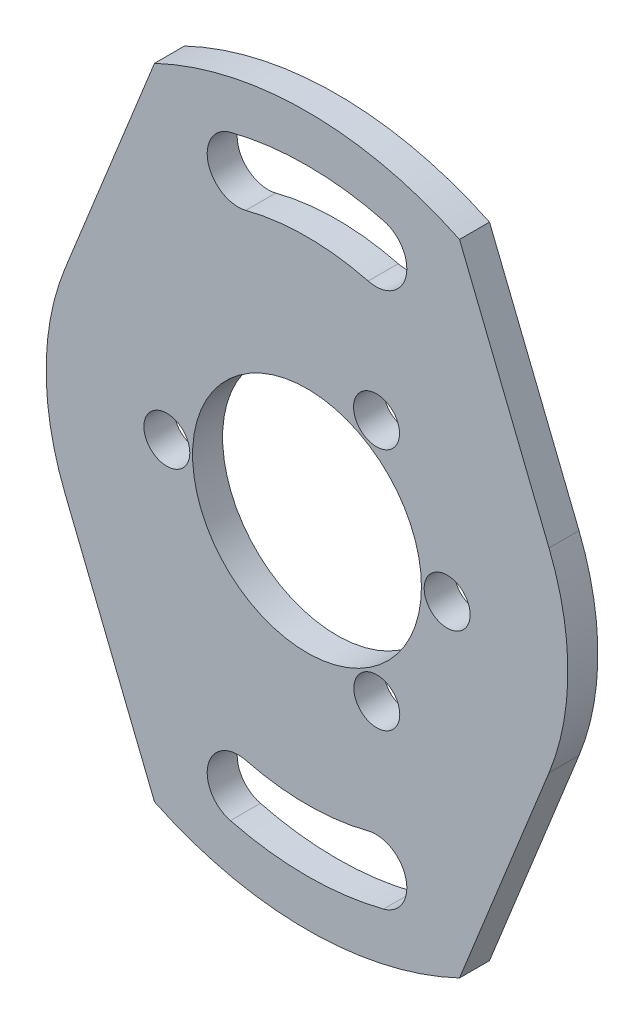
ISO-10303-21;
HEADER;
FILE_DESCRIPTION(('STEP AP214'),'2;1');
FILE_NAME('part.step','',(''),(''),'','','');
FILE_SCHEMA(('AUTOMOTIVE_DESIGN { 1 0 10303 214 1 1 1 1 }'));
ENDSEC;
DATA;
#1=APPLICATION_CONTEXT('core data for automotive mechanical design processes');
#2=APPLICATION_PROTOCOL_DEFINITION('international standard','automotive_design',2000,#1);
#3=PRODUCT_CONTEXT('',#1,'mechanical');
#4=PRODUCT('Part','Part','',(#3));
#5=PRODUCT_RELATED_PRODUCT_CATEGORY('part','',(#4));
#6=PRODUCT_DEFINITION_FORMATION('','',#4);
#7=PRODUCT_DEFINITION_CONTEXT('part definition',#1,'design');
#8=PRODUCT_DEFINITION('design','',#6,#7);
#9=PRODUCT_DEFINITION_SHAPE('','',#8);
#10=(LENGTH_UNIT() NAMED_UNIT(*) SI_UNIT(.MILLI.,.METRE.));
#11=(NAMED_UNIT(*) PLANE_ANGLE_UNIT() SI_UNIT($,.RADIAN.));
#12=(NAMED_UNIT(*) SI_UNIT($,.STERADIAN.) SOLID_ANGLE_UNIT());
#13=UNCERTAINTY_MEASURE_WITH_UNIT(LENGTH_MEASURE(1.E-05),#10,'distance_accuracy_value','');
#14=(GEOMETRIC_REPRESENTATION_CONTEXT(3) GLOBAL_UNCERTAINTY_ASSIGNED_CONTEXT((#13)) GLOBAL_UNIT_ASSIGNED_CONTEXT((#10,
#11,#12)) REPRESENTATION_CONTEXT('',''));
#15=CARTESIAN_POINT('',(0.,0.,0.));
#16=DIRECTION('',(0.,0.,1.));
#17=DIRECTION('',(1.,0.,0.));
#18=AXIS2_PLACEMENT_3D('',#15,#16,#17);
#19=CARTESIAN_POINT('',(-3.675,-14.3003356603963,1.6));
#20=DIRECTION('',(0.,0.,-1.));
#21=DIRECTION('',(-1.,0.,0.));
#22=AXIS2_PLACEMENT_3D('',#19,#20,#21);
#23=CYLINDRICAL_SURFACE('',#22,1.65);
#24=CARTESIAN_POINT('',(-3.675,-14.3003356603963,0.));
#25=DIRECTION('',(0.,0.,1.));
#26=DIRECTION('',(1.,0.,0.));
#27=AXIS2_PLACEMENT_3D('',#24,#25,#26);
#28=CIRCLE('',#27,1.65);
#29=CARTESIAN_POINT('',(-3.26431594988148,-12.702262254392,0.));
#30=VERTEX_POINT('',#29);
#31=CARTESIAN_POINT('',(-4.08568405011853,-15.8984090664006,0.));
#32=VERTEX_POINT('',#31);
#33=EDGE_CURVE('E255',#30,#32,#28,.T.);
#34=ORIENTED_EDGE('',*,*,#33,.F.);
#35=DIRECTION('',(0.,0.,-1.));
#36=VECTOR('',#35,1.);
#37=CARTESIAN_POINT('',(-3.26431594988148,-12.702262254392,1.6));
#38=LINE('',#37,#36);
#39=CARTESIAN_POINT('',(-3.26431594988148,-12.702262254392,1.6));
#40=VERTEX_POINT('',#39);
#41=EDGE_CURVE('E11',#40,#30,#38,.T.);
#42=ORIENTED_EDGE('',*,*,#41,.F.);
#43=CARTESIAN_POINT('',(-3.675,-14.3003356603963,1.6));
#44=DIRECTION('',(0.,0.,1.));
#45=DIRECTION('',(1.,0.,0.));
#46=AXIS2_PLACEMENT_3D('',#43,#44,#45);
#47=CIRCLE('',#46,1.65);
#48=CARTESIAN_POINT('',(-4.08568405011853,-15.8984090664006,1.6));
#49=VERTEX_POINT('',#48);
#50=EDGE_CURVE('E171',#40,#49,#47,.T.);
#51=ORIENTED_EDGE('',*,*,#50,.T.);
#52=DIRECTION('',(0.,0.,-1.));
#53=VECTOR('',#52,1.);
#54=CARTESIAN_POINT('',(-4.08568405011853,-15.8984090664006,1.6));
#55=LINE('',#54,#53);
#56=EDGE_CURVE('E61',#49,#32,#55,.T.);
#57=ORIENTED_EDGE('',*,*,#56,.T.);
#58=EDGE_LOOP('',(#34,#42,#51,#57));
#59=FACE_BOUND('',#58,.T.);
#60=ADVANCED_FACE('F41',(#59),#23,.F.);
#61=CARTESIAN_POINT('',(0.,0.,1.6));
#62=DIRECTION('',(0.,0.,-1.));
#63=DIRECTION('',(-1.,0.,0.));
#64=AXIS2_PLACEMENT_3D('',#61,#62,#63);
#65=CYLINDRICAL_SURFACE('',#64,13.115);
#66=CARTESIAN_POINT('',(0.,0.,0.));
#67=DIRECTION('',(0.,0.,1.));
#68=DIRECTION('',(1.,0.,0.));
#69=AXIS2_PLACEMENT_3D('',#66,#67,#68);
#70=CIRCLE('',#69,13.115);
#71=CARTESIAN_POINT('',(3.26431594988147,-12.702262254392,0.));
#72=VERTEX_POINT('',#71);
#73=EDGE_CURVE('E178',#30,#72,#70,.T.);
#74=ORIENTED_EDGE('',*,*,#73,.T.);
#75=DIRECTION('',(0.,0.,-1.));
#76=VECTOR('',#75,1.);
#77=CARTESIAN_POINT('',(3.26431594988147,-12.702262254392,1.6));
#78=LINE('',#77,#76);
#79=CARTESIAN_POINT('',(3.26431594988147,-12.702262254392,1.6));
#80=VERTEX_POINT('',#79);
#81=EDGE_CURVE('E52',#80,#72,#78,.T.);
#82=ORIENTED_EDGE('',*,*,#81,.F.);
#83=CARTESIAN_POINT('',(0.,0.,1.6));
#84=DIRECTION('',(0.,0.,1.));
#85=DIRECTION('',(1.,0.,0.));
#86=AXIS2_PLACEMENT_3D('',#83,#84,#85);
#87=CIRCLE('',#86,13.115);
#88=EDGE_CURVE('E164',#40,#80,#87,.T.);
#89=ORIENTED_EDGE('',*,*,#88,.F.);
#90=ORIENTED_EDGE('',*,*,#41,.T.);
#91=EDGE_LOOP('',(#74,#82,#89,#90));
#92=FACE_BOUND('',#91,.T.);
#93=ADVANCED_FACE('F176',(#92),#65,.T.);
#94=CARTESIAN_POINT('',(3.675,-14.3003356603963,1.6));
#95=DIRECTION('',(0.,0.,-1.));
#96=DIRECTION('',(-1.,0.,0.));
#97=AXIS2_PLACEMENT_3D('',#94,#95,#96);
#98=CYLINDRICAL_SURFACE('',#97,1.65);
#99=CARTESIAN_POINT('',(3.675,-14.3003356603963,0.));
#100=DIRECTION('',(0.,0.,1.));
#101=DIRECTION('',(1.,0.,0.));
#102=AXIS2_PLACEMENT_3D('',#99,#100,#101);
#103=CIRCLE('',#102,1.65);
#104=CARTESIAN_POINT('',(4.08568405011851,-15.8984090664006,0.));
#105=VERTEX_POINT('',#104);
#106=EDGE_CURVE('E260',#105,#72,#103,.T.);
#107=ORIENTED_EDGE('',*,*,#106,.F.);
#108=DIRECTION('',(0.,0.,-1.));
#109=VECTOR('',#108,1.);
#110=CARTESIAN_POINT('',(4.08568405011851,-15.8984090664006,1.6));
#111=LINE('',#110,#109);
#112=CARTESIAN_POINT('',(4.08568405011851,-15.8984090664006,1.6));
#113=VERTEX_POINT('',#112);
#114=EDGE_CURVE('E110',#113,#105,#111,.T.);
#115=ORIENTED_EDGE('',*,*,#114,.F.);
#116=CARTESIAN_POINT('',(3.675,-14.3003356603963,1.6));
#117=DIRECTION('',(0.,0.,1.));
#118=DIRECTION('',(1.,0.,0.));
#119=AXIS2_PLACEMENT_3D('',#116,#117,#118);
#120=CIRCLE('',#119,1.65);
#121=EDGE_CURVE('E170',#113,#80,#120,.T.);
#122=ORIENTED_EDGE('',*,*,#121,.T.);
#123=ORIENTED_EDGE('',*,*,#81,.T.);
#124=EDGE_LOOP('',(#107,#115,#122,#123));
#125=FACE_BOUND('',#124,.T.);
#126=ADVANCED_FACE('F183',(#125),#98,.F.);
#127=CARTESIAN_POINT('',(3.675,14.3003356603961,1.6));
#128=DIRECTION('',(0.,0.,-1.));
#129=DIRECTION('',(-1.,0.,0.));
#130=AXIS2_PLACEMENT_3D('',#127,#128,#129);
#131=CYLINDRICAL_SURFACE('',#130,1.65);
#132=CARTESIAN_POINT('',(3.675,14.3003356603961,0.));
#133=DIRECTION('',(0.,0.,1.));
#134=DIRECTION('',(1.,0.,0.));
#135=AXIS2_PLACEMENT_3D('',#132,#133,#134);
#136=CIRCLE('',#135,1.65);
#137=CARTESIAN_POINT('',(4.08568405011852,15.8984090664006,0.));
#138=VERTEX_POINT('',#137);
#139=CARTESIAN_POINT('',(3.26431594988148,12.702262254392,0.));
#140=VERTEX_POINT('',#139);
#141=EDGE_CURVE('E241',#138,#140,#136,.F.);
#142=ORIENTED_EDGE('',*,*,#141,.T.);
#143=DIRECTION('',(0.,0.,-1.));
#144=VECTOR('',#143,1.);
#145=CARTESIAN_POINT('',(3.26431594988148,12.702262254392,1.6));
#146=LINE('',#145,#144);
#147=CARTESIAN_POINT('',(3.26431594988148,12.702262254392,1.6));
#148=VERTEX_POINT('',#147);
#149=EDGE_CURVE('E286',#148,#140,#146,.T.);
#150=ORIENTED_EDGE('',*,*,#149,.F.);
#151=CARTESIAN_POINT('',(3.675,14.3003356603961,1.6));
#152=DIRECTION('',(0.,0.,1.));
#153=DIRECTION('',(1.,0.,0.));
#154=AXIS2_PLACEMENT_3D('',#151,#152,#153);
#155=CIRCLE('',#154,1.65);
#156=CARTESIAN_POINT('',(4.08568405011852,15.8984090664006,1.6));
#157=VERTEX_POINT('',#156);
#158=EDGE_CURVE('E375',#157,#148,#155,.F.);
#159=ORIENTED_EDGE('',*,*,#158,.F.);
#160=DIRECTION('',(0.,0.,-1.));
#161=VECTOR('',#160,1.);
#162=CARTESIAN_POINT('',(4.08568405011852,15.8984090664006,1.6));
#163=LINE('',#162,#161);
#164=EDGE_CURVE('E289',#157,#138,#163,.T.);
#165=ORIENTED_EDGE('',*,*,#164,.T.);
#166=EDGE_LOOP('',(#142,#150,#159,#165));
#167=FACE_BOUND('',#166,.T.);
#168=ADVANCED_FACE('F418',(#167),#131,.F.);
#169=CARTESIAN_POINT('',(0.,0.,1.6));
#170=DIRECTION('',(0.,0.,-1.));
#171=DIRECTION('',(-1.,0.,0.));
#172=AXIS2_PLACEMENT_3D('',#169,#170,#171);
#173=CYLINDRICAL_SURFACE('',#172,13.1150000000002);
#174=CARTESIAN_POINT('',(0.,0.,0.));
#175=DIRECTION('',(0.,0.,1.));
#176=DIRECTION('',(1.,0.,0.));
#177=AXIS2_PLACEMENT_3D('',#174,#175,#176);
#178=CIRCLE('',#177,13.1150000000002);
#179=CARTESIAN_POINT('',(-3.26431594988148,12.702262254392,0.));
#180=VERTEX_POINT('',#179);
#181=EDGE_CURVE('E245',#180,#140,#178,.F.);
#182=ORIENTED_EDGE('',*,*,#181,.F.);
#183=DIRECTION('',(0.,0.,-1.));
#184=VECTOR('',#183,1.);
#185=CARTESIAN_POINT('',(-3.26431594988148,12.702262254392,1.6));
#186=LINE('',#185,#184);
#187=CARTESIAN_POINT('',(-3.26431594988148,12.702262254392,1.6));
#188=VERTEX_POINT('',#187);
#189=EDGE_CURVE('E297',#188,#180,#186,.T.);
#190=ORIENTED_EDGE('',*,*,#189,.F.);
#191=CARTESIAN_POINT('',(0.,0.,1.6));
#192=DIRECTION('',(0.,0.,1.));
#193=DIRECTION('',(1.,0.,0.));
#194=AXIS2_PLACEMENT_3D('',#191,#192,#193);
#195=CIRCLE('',#194,13.1150000000002);
#196=EDGE_CURVE('E378',#188,#148,#195,.F.);
#197=ORIENTED_EDGE('',*,*,#196,.T.);
#198=ORIENTED_EDGE('',*,*,#149,.T.);
#199=EDGE_LOOP('',(#182,#190,#197,#198));
#200=FACE_BOUND('',#199,.T.);
#201=ADVANCED_FACE('F414',(#200),#173,.T.);
#202=CARTESIAN_POINT('',(-3.675,14.3003356603961,1.6));
#203=DIRECTION('',(0.,0.,-1.));
#204=DIRECTION('',(-1.,0.,0.));
#205=AXIS2_PLACEMENT_3D('',#202,#203,#204);
#206=CYLINDRICAL_SURFACE('',#205,1.65);
#207=CARTESIAN_POINT('',(-3.675,14.3003356603961,0.));
#208=DIRECTION('',(0.,0.,1.));
#209=DIRECTION('',(1.,0.,0.));
#210=AXIS2_PLACEMENT_3D('',#207,#208,#209);
#211=CIRCLE('',#210,1.65);
#212=CARTESIAN_POINT('',(-4.08568405011852,15.8984090664006,0.));
#213=VERTEX_POINT('',#212);
#214=EDGE_CURVE('E249',#180,#213,#211,.F.);
#215=ORIENTED_EDGE('',*,*,#214,.T.);
#216=DIRECTION('',(0.,0.,-1.));
#217=VECTOR('',#216,1.);
#218=CARTESIAN_POINT('',(-4.08568405011852,15.8984090664006,1.6));
#219=LINE('',#218,#217);
#220=CARTESIAN_POINT('',(-4.08568405011852,15.8984090664006,1.6));
#221=VERTEX_POINT('',#220);
#222=EDGE_CURVE('E293',#221,#213,#219,.T.);
#223=ORIENTED_EDGE('',*,*,#222,.F.);
#224=CARTESIAN_POINT('',(-3.675,14.3003356603961,1.6));
#225=DIRECTION('',(0.,0.,1.));
#226=DIRECTION('',(1.,0.,0.));
#227=AXIS2_PLACEMENT_3D('',#224,#225,#226);
#228=CIRCLE('',#227,1.65);
#229=EDGE_CURVE('E382',#188,#221,#228,.F.);
#230=ORIENTED_EDGE('',*,*,#229,.F.);
#231=ORIENTED_EDGE('',*,*,#189,.T.);
#232=EDGE_LOOP('',(#215,#223,#230,#231));
#233=FACE_BOUND('',#232,.T.);
#234=ADVANCED_FACE('F411',(#233),#206,.F.);
#235=CARTESIAN_POINT('',(12.9092139620096,5.19417172252296,1.6));
#236=DIRECTION('',(-0.927719292993861,-0.373278600253177,0.));
#237=DIRECTION('',(0.373278600253177,-0.927719292993861,0.));
#238=AXIS2_PLACEMENT_3D('',#235,#236,#237);
#239=PLANE('',#238);
#240=DIRECTION('',(-0.373278600253177,0.927719292993861,0.));
#241=VECTOR('',#240,1.);
#242=CARTESIAN_POINT('',(12.9092139620096,5.19417172252296,0.));
#243=LINE('',#242,#241);
#244=CARTESIAN_POINT('',(12.9092139620096,5.19417172252296,0.));
#245=VERTEX_POINT('',#244);
#246=CARTESIAN_POINT('',(8.135,17.0596534255535,0.));
#247=VERTEX_POINT('',#246);
#248=EDGE_CURVE('E208',#245,#247,#243,.T.);
#249=ORIENTED_EDGE('',*,*,#248,.T.);
#250=DIRECTION('',(0.,0.,-1.));
#251=VECTOR('',#250,1.);
#252=CARTESIAN_POINT('',(8.135,17.0596534255535,1.6));
#253=LINE('',#252,#251);
#254=CARTESIAN_POINT('',(8.135,17.0596534255535,1.6));
#255=VERTEX_POINT('',#254);
#256=EDGE_CURVE('E45',#255,#247,#253,.T.);
#257=ORIENTED_EDGE('',*,*,#256,.F.);
#258=DIRECTION('',(-0.373278600253177,0.927719292993861,0.));
#259=VECTOR('',#258,1.);
#260=CARTESIAN_POINT('',(12.9092139620096,5.19417172252296,1.6));
#261=LINE('',#260,#259);
#262=CARTESIAN_POINT('',(12.9092139620096,5.19417172252296,1.6));
#263=VERTEX_POINT('',#262);
#264=EDGE_CURVE('E283',#263,#255,#261,.T.);
#265=ORIENTED_EDGE('',*,*,#264,.F.);
#266=DIRECTION('',(0.,0.,-1.));
#267=VECTOR('',#266,1.);
#268=CARTESIAN_POINT('',(12.9092139620096,5.19417172252296,1.6));
#269=LINE('',#268,#267);
#270=EDGE_CURVE('E207',#263,#245,#269,.T.);
#271=ORIENTED_EDGE('',*,*,#270,.T.);
#272=EDGE_LOOP('',(#249,#257,#265,#271));
#273=FACE_BOUND('',#272,.T.);
#274=ADVANCED_FACE('F43',(#273),#239,.F.);
#275=CARTESIAN_POINT('',(0.,0.,1.6));
#276=DIRECTION('',(0.,0.,-1.));
#277=DIRECTION('',(-1.,0.,0.));
#278=AXIS2_PLACEMENT_3D('',#275,#276,#277);
#279=CYLINDRICAL_SURFACE('',#278,18.9);
#280=CARTESIAN_POINT('',(0.,0.,0.));
#281=DIRECTION('',(0.,0.,1.));
#282=DIRECTION('',(1.,0.,0.));
#283=AXIS2_PLACEMENT_3D('',#280,#281,#282);
#284=CIRCLE('',#283,18.9);
#285=CARTESIAN_POINT('',(-8.135,17.0596534255535,0.));
#286=VERTEX_POINT('',#285);
#287=EDGE_CURVE('E212',#247,#286,#284,.T.);
#288=ORIENTED_EDGE('',*,*,#287,.T.);
#289=DIRECTION('',(0.,0.,-1.));
#290=VECTOR('',#289,1.);
#291=CARTESIAN_POINT('',(-8.135,17.0596534255535,1.6));
#292=LINE('',#291,#290);
#293=CARTESIAN_POINT('',(-8.135,17.0596534255535,1.6));
#294=VERTEX_POINT('',#293);
#295=EDGE_CURVE('E321',#294,#286,#292,.T.);
#296=ORIENTED_EDGE('',*,*,#295,.F.);
#297=CARTESIAN_POINT('',(0.,0.,1.6));
#298=DIRECTION('',(0.,0.,1.));
#299=DIRECTION('',(1.,0.,0.));
#300=AXIS2_PLACEMENT_3D('',#297,#298,#299);
#301=CIRCLE('',#300,18.9);
#302=EDGE_CURVE('E123',#255,#294,#301,.T.);
#303=ORIENTED_EDGE('',*,*,#302,.F.);
#304=ORIENTED_EDGE('',*,*,#256,.T.);
#305=EDGE_LOOP('',(#288,#296,#303,#304));
#306=FACE_BOUND('',#305,.T.);
#307=ADVANCED_FACE('F328',(#306),#279,.T.);
#308=CARTESIAN_POINT('',(-12.9092139620096,5.19417172252297,1.6));
#309=DIRECTION('',(-0.927719292993861,0.373278600253178,0.));
#310=DIRECTION('',(-0.373278600253178,-0.927719292993861,0.));
#311=AXIS2_PLACEMENT_3D('',#308,#309,#310);
#312=PLANE('',#311);
#313=DIRECTION('',(0.373278600253178,0.927719292993861,0.));
#314=VECTOR('',#313,1.);
#315=CARTESIAN_POINT('',(-12.9092139620096,5.19417172252297,0.));
#316=LINE('',#315,#314);
#317=CARTESIAN_POINT('',(-12.9092139620096,5.19417172252297,0.));
#318=VERTEX_POINT('',#317);
#319=EDGE_CURVE('E216',#318,#286,#316,.T.);
#320=ORIENTED_EDGE('',*,*,#319,.F.);
#321=DIRECTION('',(0.,0.,-1.));
#322=VECTOR('',#321,1.);
#323=CARTESIAN_POINT('',(-12.9092139620096,5.19417172252297,1.6));
#324=LINE('',#323,#322);
#325=CARTESIAN_POINT('',(-12.9092139620096,5.19417172252297,1.6));
#326=VERTEX_POINT('',#325);
#327=EDGE_CURVE('E319',#326,#318,#324,.T.);
#328=ORIENTED_EDGE('',*,*,#327,.F.);
#329=DIRECTION('',(0.373278600253178,0.927719292993861,0.));
#330=VECTOR('',#329,1.);
#331=CARTESIAN_POINT('',(-12.9092139620096,5.19417172252297,1.6));
#332=LINE('',#331,#330);
#333=EDGE_CURVE('E342',#326,#294,#332,.T.);
#334=ORIENTED_EDGE('',*,*,#333,.T.);
#335=ORIENTED_EDGE('',*,*,#295,.T.);
#336=EDGE_LOOP('',(#320,#328,#334,#335));
#337=FACE_BOUND('',#336,.T.);
#338=ADVANCED_FACE('F339',(#337),#312,.T.);
#339=CARTESIAN_POINT('',(0.,0.,1.6));
#340=DIRECTION('',(0.,0.,-1.));
#341=DIRECTION('',(-1.,0.,0.));
#342=AXIS2_PLACEMENT_3D('',#339,#340,#341);
#343=CYLINDRICAL_SURFACE('',#342,13.915);
#344=CARTESIAN_POINT('',(0.,0.,0.));
#345=DIRECTION('',(0.,0.,1.));
#346=DIRECTION('',(1.,0.,0.));
#347=AXIS2_PLACEMENT_3D('',#344,#345,#346);
#348=CIRCLE('',#347,13.915);
#349=CARTESIAN_POINT('',(-12.9092139620096,-5.19417172252296,0.));
#350=VERTEX_POINT('',#349);
#351=EDGE_CURVE('E220',#318,#350,#348,.T.);
#352=ORIENTED_EDGE('',*,*,#351,.T.);
#353=DIRECTION('',(0.,0.,-1.));
#354=VECTOR('',#353,1.);
#355=CARTESIAN_POINT('',(-12.9092139620096,-5.19417172252296,1.6));
#356=LINE('',#355,#354);
#357=CARTESIAN_POINT('',(-12.9092139620096,-5.19417172252296,1.6));
#358=VERTEX_POINT('',#357);
#359=EDGE_CURVE('E316',#358,#350,#356,.T.);
#360=ORIENTED_EDGE('',*,*,#359,.F.);
#361=CARTESIAN_POINT('',(0.,0.,1.6));
#362=DIRECTION('',(0.,0.,1.));
#363=DIRECTION('',(1.,0.,0.));
#364=AXIS2_PLACEMENT_3D('',#361,#362,#363);
#365=CIRCLE('',#364,13.915);
#366=EDGE_CURVE('E345',#326,#358,#365,.T.);
#367=ORIENTED_EDGE('',*,*,#366,.F.);
#368=ORIENTED_EDGE('',*,*,#327,.T.);
#369=EDGE_LOOP('',(#352,#360,#367,#368));
#370=FACE_BOUND('',#369,.T.);
#371=ADVANCED_FACE('F346',(#370),#343,.T.);
#372=CARTESIAN_POINT('',(-12.9092139620096,-5.19417172252296,1.6));
#373=DIRECTION('',(-0.927719292993861,-0.373278600253177,0.));
#374=DIRECTION('',(0.373278600253177,-0.927719292993861,0.));
#375=AXIS2_PLACEMENT_3D('',#372,#373,#374);
#376=PLANE('',#375);
#377=DIRECTION('',(-0.373278600253177,0.927719292993861,0.));
#378=VECTOR('',#377,1.);
#379=CARTESIAN_POINT('',(-12.9092139620096,-5.19417172252296,0.));
#380=LINE('',#379,#378);
#381=CARTESIAN_POINT('',(-8.135,-17.0596534255535,0.));
#382=VERTEX_POINT('',#381);
#383=EDGE_CURVE('E224',#382,#350,#380,.T.);
#384=ORIENTED_EDGE('',*,*,#383,.F.);
#385=DIRECTION('',(0.,0.,-1.));
#386=VECTOR('',#385,1.);
#387=CARTESIAN_POINT('',(-8.135,-17.0596534255535,1.6));
#388=LINE('',#387,#386);
#389=CARTESIAN_POINT('',(-8.135,-17.0596534255535,1.6));
#390=VERTEX_POINT('',#389);
#391=EDGE_CURVE('E313',#390,#382,#388,.T.);
#392=ORIENTED_EDGE('',*,*,#391,.F.);
#393=DIRECTION('',(-0.373278600253177,0.927719292993861,0.));
#394=VECTOR('',#393,1.);
#395=CARTESIAN_POINT('',(-12.9092139620096,-5.19417172252296,1.6));
#396=LINE('',#395,#394);
#397=EDGE_CURVE('E351',#390,#358,#396,.T.);
#398=ORIENTED_EDGE('',*,*,#397,.T.);
#399=ORIENTED_EDGE('',*,*,#359,.T.);
#400=EDGE_LOOP('',(#384,#392,#398,#399));
#401=FACE_BOUND('',#400,.T.);
#402=ADVANCED_FACE('F439',(#401),#376,.T.);
#403=CARTESIAN_POINT('',(0.,0.,1.6));
#404=DIRECTION('',(0.,0.,-1.));
#405=DIRECTION('',(-1.,0.,0.));
#406=AXIS2_PLACEMENT_3D('',#403,#404,#405);
#407=CYLINDRICAL_SURFACE('',#406,18.9);
#408=CARTESIAN_POINT('',(0.,0.,0.));
#409=DIRECTION('',(0.,0.,1.));
#410=DIRECTION('',(1.,0.,0.));
#411=AXIS2_PLACEMENT_3D('',#408,#409,#410);
#412=CIRCLE('',#411,18.9);
#413=CARTESIAN_POINT('',(8.135,-17.0596534255535,0.));
#414=VERTEX_POINT('',#413);
#415=EDGE_CURVE('E228',#382,#414,#412,.T.);
#416=ORIENTED_EDGE('',*,*,#415,.T.);
#417=DIRECTION('',(0.,0.,-1.));
#418=VECTOR('',#417,1.);
#419=CARTESIAN_POINT('',(8.135,-17.0596534255535,1.6));
#420=LINE('',#419,#418);
#421=CARTESIAN_POINT('',(8.135,-17.0596534255535,1.6));
#422=VERTEX_POINT('',#421);
#423=EDGE_CURVE('E309',#422,#414,#420,.T.);
#424=ORIENTED_EDGE('',*,*,#423,.F.);
#425=CARTESIAN_POINT('',(0.,0.,1.6));
#426=DIRECTION('',(0.,0.,1.));
#427=DIRECTION('',(1.,0.,0.));
#428=AXIS2_PLACEMENT_3D('',#425,#426,#427);
#429=CIRCLE('',#428,18.9);
#430=EDGE_CURVE('E362',#390,#422,#429,.T.);
#431=ORIENTED_EDGE('',*,*,#430,.F.);
#432=ORIENTED_EDGE('',*,*,#391,.T.);
#433=EDGE_LOOP('',(#416,#424,#431,#432));
#434=FACE_BOUND('',#433,.T.);
#435=ADVANCED_FACE('F435',(#434),#407,.T.);
#436=CARTESIAN_POINT('',(12.9092139620096,-5.19417172252296,1.6));
#437=DIRECTION('',(-0.927719292993861,0.373278600253177,0.));
#438=DIRECTION('',(-0.373278600253177,-0.927719292993861,0.));
#439=AXIS2_PLACEMENT_3D('',#436,#437,#438);
#440=PLANE('',#439);
#441=DIRECTION('',(0.373278600253177,0.927719292993861,0.));
#442=VECTOR('',#441,1.);
#443=CARTESIAN_POINT('',(12.9092139620096,-5.19417172252296,0.));
#444=LINE('',#443,#442);
#445=CARTESIAN_POINT('',(12.9092139620096,-5.19417172252296,0.));
#446=VERTEX_POINT('',#445);
#447=EDGE_CURVE('E231',#414,#446,#444,.T.);
#448=ORIENTED_EDGE('',*,*,#447,.T.);
#449=DIRECTION('',(0.,0.,-1.));
#450=VECTOR('',#449,1.);
#451=CARTESIAN_POINT('',(12.9092139620096,-5.19417172252296,1.6));
#452=LINE('',#451,#450);
#453=CARTESIAN_POINT('',(12.9092139620096,-5.19417172252296,1.6));
#454=VERTEX_POINT('',#453);
#455=EDGE_CURVE('E305',#454,#446,#452,.T.);
#456=ORIENTED_EDGE('',*,*,#455,.F.);
#457=DIRECTION('',(0.373278600253177,0.927719292993861,0.));
#458=VECTOR('',#457,1.);
#459=CARTESIAN_POINT('',(12.9092139620096,-5.19417172252296,1.6));
#460=LINE('',#459,#458);
#461=EDGE_CURVE('E365',#422,#454,#460,.T.);
#462=ORIENTED_EDGE('',*,*,#461,.F.);
#463=ORIENTED_EDGE('',*,*,#423,.T.);
#464=EDGE_LOOP('',(#448,#456,#462,#463));
#465=FACE_BOUND('',#464,.T.);
#466=ADVANCED_FACE('F431',(#465),#440,.F.);
#467=CARTESIAN_POINT('',(7.476059495,0.,1.6));
#468=DIRECTION('',(0.,0.,-1.));
#469=DIRECTION('',(-1.,0.,0.));
#470=AXIS2_PLACEMENT_3D('',#467,#468,#469);
#471=CYLINDRICAL_SURFACE('',#470,1.22484039518668);
#472=CARTESIAN_POINT('',(7.476059495,0.,1.6));
#473=DIRECTION('',(0.,0.,1.));
#474=DIRECTION('',(1.,0.,0.));
#475=AXIS2_PLACEMENT_3D('',#472,#473,#474);
#476=CIRCLE('',#475,1.22484039518668);
#477=CARTESIAN_POINT('',(8.70089989018668,0.,1.6));
#478=VERTEX_POINT('',#477);
#479=EDGE_CURVE('E199',#478,#478,#476,.T.);
#480=ORIENTED_EDGE('',*,*,#479,.T.);
#481=EDGE_LOOP('',(#480));
#482=FACE_BOUND('',#481,.T.);
#483=CARTESIAN_POINT('',(7.476059495,0.,0.));
#484=DIRECTION('',(0.,0.,1.));
#485=DIRECTION('',(1.,0.,0.));
#486=AXIS2_PLACEMENT_3D('',#483,#484,#485);
#487=CIRCLE('',#486,1.22484039518668);
#488=CARTESIAN_POINT('',(8.70089989018668,0.,0.));
#489=VERTEX_POINT('',#488);
#490=EDGE_CURVE('E275',#489,#489,#487,.T.);
#491=ORIENTED_EDGE('',*,*,#490,.F.);
#492=EDGE_LOOP('',(#491));
#493=FACE_BOUND('',#492,.T.);
#494=ADVANCED_FACE('F434',(#482,#493),#471,.F.);
#495=CARTESIAN_POINT('',(3.72330191006806,-6.48293825817146,1.6));
#496=DIRECTION('',(0.,0.,-1.));
#497=DIRECTION('',(-1.,0.,0.));
#498=AXIS2_PLACEMENT_3D('',#495,#496,#497);
#499=CYLINDRICAL_SURFACE('',#498,1.22484039518669);
#500=CARTESIAN_POINT('',(3.72330191006806,-6.48293825817146,1.6));
#501=DIRECTION('',(0.,0.,1.));
#502=DIRECTION('',(1.,0.,0.));
#503=AXIS2_PLACEMENT_3D('',#500,#501,#502);
#504=CIRCLE('',#503,1.22484039518669);
#505=CARTESIAN_POINT('',(4.94814230525474,-6.48293825817146,1.6));
#506=VERTEX_POINT('',#505);
#507=EDGE_CURVE('E195',#506,#506,#504,.T.);
#508=ORIENTED_EDGE('',*,*,#507,.T.);
#509=EDGE_LOOP('',(#508));
#510=FACE_BOUND('',#509,.T.);
#511=CARTESIAN_POINT('',(3.72330191006806,-6.48293825817146,0.));
#512=DIRECTION('',(0.,0.,1.));
#513=DIRECTION('',(1.,0.,0.));
#514=AXIS2_PLACEMENT_3D('',#511,#512,#513);
#515=CIRCLE('',#514,1.22484039518669);
#516=CARTESIAN_POINT('',(4.94814230525474,-6.48293825817146,0.));
#517=VERTEX_POINT('',#516);
#518=EDGE_CURVE('E271',#517,#517,#515,.T.);
#519=ORIENTED_EDGE('',*,*,#518,.F.);
#520=EDGE_LOOP('',(#519));
#521=FACE_BOUND('',#520,.T.);
#522=ADVANCED_FACE('F400',(#510,#521),#499,.F.);
#523=CARTESIAN_POINT('',(-7.476059495,0.,1.6));
#524=DIRECTION('',(0.,0.,-1.));
#525=DIRECTION('',(-1.,0.,0.));
#526=AXIS2_PLACEMENT_3D('',#523,#524,#525);
#527=CYLINDRICAL_SURFACE('',#526,1.22484039518603);
#528=CARTESIAN_POINT('',(-7.476059495,0.,1.6));
#529=DIRECTION('',(0.,0.,1.));
#530=DIRECTION('',(1.,0.,0.));
#531=AXIS2_PLACEMENT_3D('',#528,#529,#530);
#532=CIRCLE('',#531,1.22484039518603);
#533=CARTESIAN_POINT('',(-6.25121909981397,0.,1.6));
#534=VERTEX_POINT('',#533);
#535=EDGE_CURVE('E188',#534,#534,#532,.T.);
#536=ORIENTED_EDGE('',*,*,#535,.T.);
#537=EDGE_LOOP('',(#536));
#538=FACE_BOUND('',#537,.T.);
#539=CARTESIAN_POINT('',(-7.476059495,0.,0.));
#540=DIRECTION('',(0.,0.,1.));
#541=DIRECTION('',(1.,0.,0.));
#542=AXIS2_PLACEMENT_3D('',#539,#540,#541);
#543=CIRCLE('',#542,1.22484039518603);
#544=CARTESIAN_POINT('',(-6.25121909981397,0.,0.));
#545=VERTEX_POINT('',#544);
#546=EDGE_CURVE('E267',#545,#545,#543,.T.);
#547=ORIENTED_EDGE('',*,*,#546,.F.);
#548=EDGE_LOOP('',(#547));
#549=FACE_BOUND('',#548,.T.);
#550=ADVANCED_FACE('F391',(#538,#549),#527,.F.);
#551=CARTESIAN_POINT('',(0.,0.,1.6));
#552=DIRECTION('',(0.,0.,-1.));
#553=DIRECTION('',(-1.,0.,0.));
#554=AXIS2_PLACEMENT_3D('',#551,#552,#553);
#555=CYLINDRICAL_SURFACE('',#554,16.415);
#556=CARTESIAN_POINT('',(0.,0.,0.));
#557=DIRECTION('',(0.,0.,1.));
#558=DIRECTION('',(1.,0.,0.));
#559=AXIS2_PLACEMENT_3D('',#556,#557,#558);
#560=CIRCLE('',#559,16.415);
#561=EDGE_CURVE('E263',#32,#105,#560,.T.);
#562=ORIENTED_EDGE('',*,*,#561,.F.);
#563=ORIENTED_EDGE('',*,*,#56,.F.);
#564=CARTESIAN_POINT('',(0.,0.,1.6));
#565=DIRECTION('',(0.,0.,1.));
#566=DIRECTION('',(1.,0.,0.));
#567=AXIS2_PLACEMENT_3D('',#564,#565,#566);
#568=CIRCLE('',#567,16.415);
#569=EDGE_CURVE('E185',#49,#113,#568,.T.);
#570=ORIENTED_EDGE('',*,*,#569,.T.);
#571=ORIENTED_EDGE('',*,*,#114,.T.);
#572=EDGE_LOOP('',(#562,#563,#570,#571));
#573=FACE_BOUND('',#572,.T.);
#574=ADVANCED_FACE('F388',(#573),#555,.F.);
#575=CARTESIAN_POINT('',(0.,0.,1.6));
#576=DIRECTION('',(0.,0.,-1.));
#577=DIRECTION('',(-1.,0.,0.));
#578=AXIS2_PLACEMENT_3D('',#575,#576,#577);
#579=CYLINDRICAL_SURFACE('',#578,16.4150000000002);
#580=CARTESIAN_POINT('',(0.,0.,0.));
#581=DIRECTION('',(0.,0.,1.));
#582=DIRECTION('',(1.,0.,0.));
#583=AXIS2_PLACEMENT_3D('',#580,#581,#582);
#584=CIRCLE('',#583,16.4150000000002);
#585=EDGE_CURVE('E252',#213,#138,#584,.F.);
#586=ORIENTED_EDGE('',*,*,#585,.T.);
#587=ORIENTED_EDGE('',*,*,#164,.F.);
#588=CARTESIAN_POINT('',(0.,0.,1.6));
#589=DIRECTION('',(0.,0.,1.));
#590=DIRECTION('',(1.,0.,0.));
#591=AXIS2_PLACEMENT_3D('',#588,#589,#590);
#592=CIRCLE('',#591,16.4150000000002);
#593=EDGE_CURVE('E385',#221,#157,#592,.F.);
#594=ORIENTED_EDGE('',*,*,#593,.F.);
#595=ORIENTED_EDGE('',*,*,#222,.T.);
#596=EDGE_LOOP('',(#586,#587,#594,#595));
#597=FACE_BOUND('',#596,.T.);
#598=ADVANCED_FACE('F390',(#597),#579,.F.);
#599=CARTESIAN_POINT('',(0.,0.,1.6));
#600=DIRECTION('',(0.,0.,-1.));
#601=DIRECTION('',(-1.,0.,0.));
#602=AXIS2_PLACEMENT_3D('',#599,#600,#601);
#603=CYLINDRICAL_SURFACE('',#602,6.10378796934448);
#604=CARTESIAN_POINT('',(0.,0.,1.6));
#605=DIRECTION('',(0.,0.,1.));
#606=DIRECTION('',(1.,0.,0.));
#607=AXIS2_PLACEMENT_3D('',#604,#605,#606);
#608=CIRCLE('',#607,6.10378796934448);
#609=CARTESIAN_POINT('',(6.10378796934448,0.,1.6));
#610=VERTEX_POINT('',#609);
#611=EDGE_CURVE('E371',#610,#610,#608,.T.);
#612=ORIENTED_EDGE('',*,*,#611,.T.);
#613=EDGE_LOOP('',(#612));
#614=FACE_BOUND('',#613,.T.);
#615=CARTESIAN_POINT('',(0.,0.,0.));
#616=DIRECTION('',(0.,0.,1.));
#617=DIRECTION('',(1.,0.,0.));
#618=AXIS2_PLACEMENT_3D('',#615,#616,#617);
#619=CIRCLE('',#618,6.10378796934448);
#620=CARTESIAN_POINT('',(6.10378796934448,0.,0.));
#621=VERTEX_POINT('',#620);
#622=EDGE_CURVE('E237',#621,#621,#619,.T.);
#623=ORIENTED_EDGE('',*,*,#622,.F.);
#624=EDGE_LOOP('',(#623));
#625=FACE_BOUND('',#624,.T.);
#626=ADVANCED_FACE('F397',(#614,#625),#603,.F.);
#627=CARTESIAN_POINT('',(0.,0.,1.6));
#628=DIRECTION('',(0.,0.,-1.));
#629=DIRECTION('',(-1.,0.,0.));
#630=AXIS2_PLACEMENT_3D('',#627,#628,#629);
#631=CYLINDRICAL_SURFACE('',#630,13.915);
#632=CARTESIAN_POINT('',(0.,0.,0.));
#633=DIRECTION('',(0.,0.,1.));
#634=DIRECTION('',(1.,0.,0.));
#635=AXIS2_PLACEMENT_3D('',#632,#633,#634);
#636=CIRCLE('',#635,13.915);
#637=EDGE_CURVE('E234',#446,#245,#636,.T.);
#638=ORIENTED_EDGE('',*,*,#637,.T.);
#639=ORIENTED_EDGE('',*,*,#270,.F.);
#640=CARTESIAN_POINT('',(0.,0.,1.6));
#641=DIRECTION('',(0.,0.,1.));
#642=DIRECTION('',(1.,0.,0.));
#643=AXIS2_PLACEMENT_3D('',#640,#641,#642);
#644=CIRCLE('',#643,13.915);
#645=EDGE_CURVE('E368',#454,#263,#644,.T.);
#646=ORIENTED_EDGE('',*,*,#645,.F.);
#647=ORIENTED_EDGE('',*,*,#455,.T.);
#648=EDGE_LOOP('',(#638,#639,#646,#647));
#649=FACE_BOUND('',#648,.T.);
#650=ADVANCED_FACE('F425',(#649),#631,.T.);
#651=CARTESIAN_POINT('',(3.70867073213523,6.49131935536862,1.6));
#652=DIRECTION('',(0.,0.,-1.));
#653=DIRECTION('',(-1.,0.,0.));
#654=AXIS2_PLACEMENT_3D('',#651,#652,#653);
#655=CYLINDRICAL_SURFACE('',#654,1.2248403951863);
#656=CARTESIAN_POINT('',(3.70867073213523,6.49131935536862,1.6));
#657=DIRECTION('',(0.,0.,1.));
#658=DIRECTION('',(1.,0.,0.));
#659=AXIS2_PLACEMENT_3D('',#656,#657,#658);
#660=CIRCLE('',#659,1.2248403951863);
#661=CARTESIAN_POINT('',(4.93351112732152,6.49131935536862,1.6));
#662=VERTEX_POINT('',#661);
#663=EDGE_CURVE('E203',#662,#662,#660,.T.);
#664=ORIENTED_EDGE('',*,*,#663,.T.);
#665=EDGE_LOOP('',(#664));
#666=FACE_BOUND('',#665,.T.);
#667=CARTESIAN_POINT('',(3.70867073213523,6.49131935536862,0.));
#668=DIRECTION('',(0.,0.,1.));
#669=DIRECTION('',(1.,0.,0.));
#670=AXIS2_PLACEMENT_3D('',#667,#668,#669);
#671=CIRCLE('',#670,1.2248403951863);
#672=CARTESIAN_POINT('',(4.93351112732152,6.49131935536862,0.));
#673=VERTEX_POINT('',#672);
#674=EDGE_CURVE('E279',#673,#673,#671,.T.);
#675=ORIENTED_EDGE('',*,*,#674,.F.);
#676=EDGE_LOOP('',(#675));
#677=FACE_BOUND('',#676,.T.);
#678=ADVANCED_FACE('F429',(#666,#677),#655,.F.);
#679=CARTESIAN_POINT('',(0.,0.,1.6));
#680=DIRECTION('',(0.,0.,1.));
#681=DIRECTION('',(1.,0.,0.));
#682=AXIS2_PLACEMENT_3D('',#679,#680,#681);
#683=PLANE('',#682);
#684=ORIENTED_EDGE('',*,*,#264,.T.);
#685=ORIENTED_EDGE('',*,*,#302,.T.);
#686=ORIENTED_EDGE('',*,*,#333,.F.);
#687=ORIENTED_EDGE('',*,*,#366,.T.);
#688=ORIENTED_EDGE('',*,*,#397,.F.);
#689=ORIENTED_EDGE('',*,*,#430,.T.);
#690=ORIENTED_EDGE('',*,*,#461,.T.);
#691=ORIENTED_EDGE('',*,*,#645,.T.);
#692=EDGE_LOOP('',(#684,#685,#686,#687,#688,#689,#690,#691));
#693=FACE_BOUND('',#692,.T.);
#694=ORIENTED_EDGE('',*,*,#611,.F.);
#695=EDGE_LOOP('',(#694));
#696=FACE_BOUND('',#695,.T.);
#697=ORIENTED_EDGE('',*,*,#158,.T.);
#698=ORIENTED_EDGE('',*,*,#196,.F.);
#699=ORIENTED_EDGE('',*,*,#229,.T.);
#700=ORIENTED_EDGE('',*,*,#593,.T.);
#701=EDGE_LOOP('',(#697,#698,#699,#700));
#702=FACE_BOUND('',#701,.T.);
#703=ORIENTED_EDGE('',*,*,#50,.F.);
#704=ORIENTED_EDGE('',*,*,#88,.T.);
#705=ORIENTED_EDGE('',*,*,#121,.F.);
#706=ORIENTED_EDGE('',*,*,#569,.F.);
#707=EDGE_LOOP('',(#703,#704,#705,#706));
#708=FACE_BOUND('',#707,.T.);
#709=ORIENTED_EDGE('',*,*,#535,.F.);
#710=EDGE_LOOP('',(#709));
#711=FACE_BOUND('',#710,.T.);
#712=ORIENTED_EDGE('',*,*,#507,.F.);
#713=EDGE_LOOP('',(#712));
#714=FACE_BOUND('',#713,.T.);
#715=ORIENTED_EDGE('',*,*,#479,.F.);
#716=EDGE_LOOP('',(#715));
#717=FACE_BOUND('',#716,.T.);
#718=ORIENTED_EDGE('',*,*,#663,.F.);
#719=EDGE_LOOP('',(#718));
#720=FACE_BOUND('',#719,.T.);
#721=ADVANCED_FACE('F166',(#693,#696,#702,#708,#711,#714,#717,#720),#683,.T.);
#722=CARTESIAN_POINT('',(0.,0.,0.));
#723=DIRECTION('',(0.,0.,1.));
#724=DIRECTION('',(1.,0.,0.));
#725=AXIS2_PLACEMENT_3D('',#722,#723,#724);
#726=PLANE('',#725);
#727=ORIENTED_EDGE('',*,*,#248,.F.);
#728=ORIENTED_EDGE('',*,*,#637,.F.);
#729=ORIENTED_EDGE('',*,*,#447,.F.);
#730=ORIENTED_EDGE('',*,*,#415,.F.);
#731=ORIENTED_EDGE('',*,*,#383,.T.);
#732=ORIENTED_EDGE('',*,*,#351,.F.);
#733=ORIENTED_EDGE('',*,*,#319,.T.);
#734=ORIENTED_EDGE('',*,*,#287,.F.);
#735=EDGE_LOOP('',(#727,#728,#729,#730,#731,#732,#733,#734));
#736=FACE_BOUND('',#735,.T.);
#737=ORIENTED_EDGE('',*,*,#622,.T.);
#738=EDGE_LOOP('',(#737));
#739=FACE_BOUND('',#738,.T.);
#740=ORIENTED_EDGE('',*,*,#141,.F.);
#741=ORIENTED_EDGE('',*,*,#585,.F.);
#742=ORIENTED_EDGE('',*,*,#214,.F.);
#743=ORIENTED_EDGE('',*,*,#181,.T.);
#744=EDGE_LOOP('',(#740,#741,#742,#743));
#745=FACE_BOUND('',#744,.T.);
#746=ORIENTED_EDGE('',*,*,#33,.T.);
#747=ORIENTED_EDGE('',*,*,#561,.T.);
#748=ORIENTED_EDGE('',*,*,#106,.T.);
#749=ORIENTED_EDGE('',*,*,#73,.F.);
#750=EDGE_LOOP('',(#746,#747,#748,#749));
#751=FACE_BOUND('',#750,.T.);
#752=ORIENTED_EDGE('',*,*,#546,.T.);
#753=EDGE_LOOP('',(#752));
#754=FACE_BOUND('',#753,.T.);
#755=ORIENTED_EDGE('',*,*,#518,.T.);
#756=EDGE_LOOP('',(#755));
#757=FACE_BOUND('',#756,.T.);
#758=ORIENTED_EDGE('',*,*,#490,.T.);
#759=EDGE_LOOP('',(#758));
#760=FACE_BOUND('',#759,.T.);
#761=ORIENTED_EDGE('',*,*,#674,.T.);
#762=EDGE_LOOP('',(#761));
#763=FACE_BOUND('',#762,.T.);
#764=ADVANCED_FACE('F335',(#736,#739,#745,#751,#754,#757,#760,#763),#726,.F.);
#765=CLOSED_SHELL('',(#60,#93,#126,#168,#201,#234,#274,#307,#338,#371,#402,#435,#466,#494,#522,
#550,#574,#598,#626,#650,#678,#721,#764));
#766=MANIFOLD_SOLID_BREP('B2',#765);
#767=ADVANCED_BREP_SHAPE_REPRESENTATION('',(#18,#766),#14);
#768=SHAPE_DEFINITION_REPRESENTATION(#9,#767);
ENDSEC;
END-ISO-10303-21;
